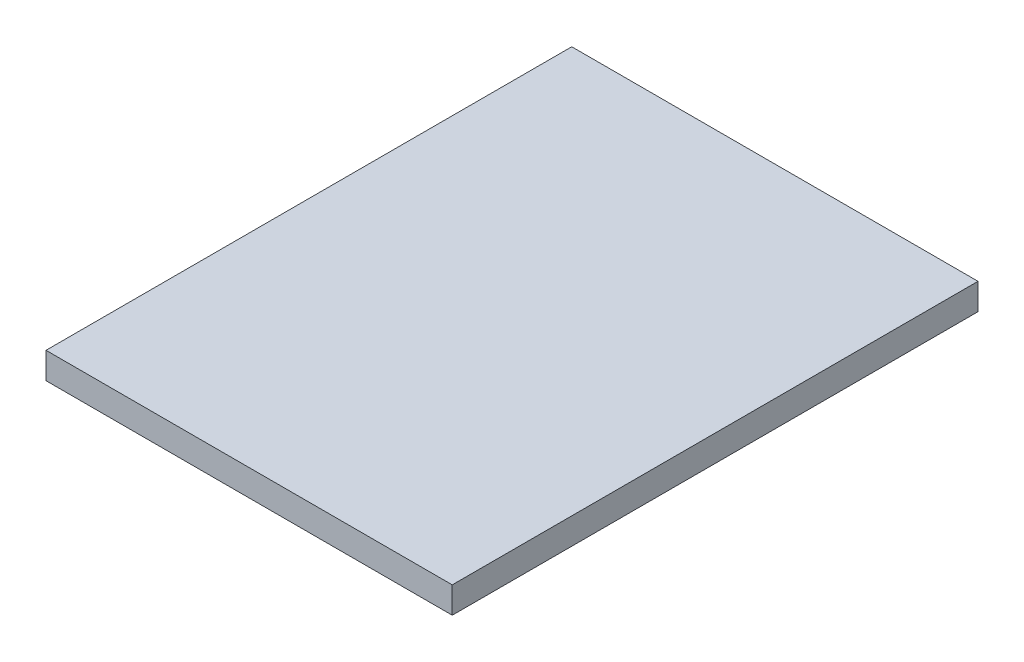
ISO-10303-21;
HEADER;
FILE_DESCRIPTION(('STEP AP214'),'2;1');
FILE_NAME('part.step','',(''),(''),'','','');
FILE_SCHEMA(('AUTOMOTIVE_DESIGN { 1 0 10303 214 1 1 1 1 }'));
ENDSEC;
DATA;
#1=APPLICATION_CONTEXT('core data for automotive mechanical design processes');
#2=APPLICATION_PROTOCOL_DEFINITION('international standard','automotive_design',2000,#1);
#3=PRODUCT_CONTEXT('',#1,'mechanical');
#4=PRODUCT('Part','Part','',(#3));
#5=PRODUCT_RELATED_PRODUCT_CATEGORY('part','',(#4));
#6=PRODUCT_DEFINITION_FORMATION('','',#4);
#7=PRODUCT_DEFINITION_CONTEXT('part definition',#1,'design');
#8=PRODUCT_DEFINITION('design','',#6,#7);
#9=PRODUCT_DEFINITION_SHAPE('','',#8);
#10=(LENGTH_UNIT() NAMED_UNIT(*) SI_UNIT(.MILLI.,.METRE.));
#11=(NAMED_UNIT(*) PLANE_ANGLE_UNIT() SI_UNIT($,.RADIAN.));
#12=(NAMED_UNIT(*) SI_UNIT($,.STERADIAN.) SOLID_ANGLE_UNIT());
#13=UNCERTAINTY_MEASURE_WITH_UNIT(LENGTH_MEASURE(1.E-05),#10,'distance_accuracy_value','');
#14=(GEOMETRIC_REPRESENTATION_CONTEXT(3) GLOBAL_UNCERTAINTY_ASSIGNED_CONTEXT((#13)) GLOBAL_UNIT_ASSIGNED_CONTEXT((#10,
#11,#12)) REPRESENTATION_CONTEXT('',''));
#15=CARTESIAN_POINT('',(0.,0.,0.));
#16=DIRECTION('',(0.,0.,1.));
#17=DIRECTION('',(1.,0.,0.));
#18=AXIS2_PLACEMENT_3D('',#15,#16,#17);
#19=CARTESIAN_POINT('',(41.5,201.5,-798.5));
#20=DIRECTION('',(-1.,0.,0.));
#21=DIRECTION('',(0.,0.,1.));
#22=AXIS2_PLACEMENT_3D('',#19,#20,#21);
#23=PLANE('',#22);
#24=DIRECTION('',(0.,-1.,0.));
#25=VECTOR('',#24,1.);
#26=CARTESIAN_POINT('',(41.5,201.5,0.));
#27=LINE('',#26,#25);
#28=CARTESIAN_POINT('',(41.5,241.5,0.));
#29=VERTEX_POINT('',#28);
#30=CARTESIAN_POINT('',(41.5,201.5,0.));
#31=VERTEX_POINT('',#30);
#32=EDGE_CURVE('E103',#29,#31,#27,.T.);
#33=ORIENTED_EDGE('',*,*,#32,.F.);
#34=DIRECTION('',(0.,0.,1.));
#35=VECTOR('',#34,1.);
#36=CARTESIAN_POINT('',(41.5,241.5,-798.5));
#37=LINE('',#36,#35);
#38=CARTESIAN_POINT('',(41.5,241.5,-798.5));
#39=VERTEX_POINT('',#38);
#40=EDGE_CURVE('E11',#39,#29,#37,.T.);
#41=ORIENTED_EDGE('',*,*,#40,.F.);
#42=DIRECTION('',(0.,-1.,0.));
#43=VECTOR('',#42,1.);
#44=CARTESIAN_POINT('',(41.5,201.5,-798.5));
#45=LINE('',#44,#43);
#46=CARTESIAN_POINT('',(41.5,201.5,-798.5));
#47=VERTEX_POINT('',#46);
#48=EDGE_CURVE('E97',#39,#47,#45,.T.);
#49=ORIENTED_EDGE('',*,*,#48,.T.);
#50=DIRECTION('',(0.,0.,1.));
#51=VECTOR('',#50,1.);
#52=CARTESIAN_POINT('',(41.5,201.5,-798.5));
#53=LINE('',#52,#51);
#54=EDGE_CURVE('E42',#47,#31,#53,.T.);
#55=ORIENTED_EDGE('',*,*,#54,.T.);
#56=EDGE_LOOP('',(#33,#41,#49,#55));
#57=FACE_BOUND('',#56,.T.);
#58=ADVANCED_FACE('F39',(#57),#23,.T.);
#59=CARTESIAN_POINT('',(41.5,241.5,-798.5));
#60=DIRECTION('',(0.,1.,0.));
#61=DIRECTION('',(0.,0.,1.));
#62=AXIS2_PLACEMENT_3D('',#59,#60,#61);
#63=PLANE('',#62);
#64=DIRECTION('',(-1.,0.,0.));
#65=VECTOR('',#64,1.);
#66=CARTESIAN_POINT('',(41.5,241.5,0.));
#67=LINE('',#66,#65);
#68=CARTESIAN_POINT('',(658.5,241.5,0.));
#69=VERTEX_POINT('',#68);
#70=EDGE_CURVE('E99',#69,#29,#67,.T.);
#71=ORIENTED_EDGE('',*,*,#70,.F.);
#72=DIRECTION('',(0.,0.,1.));
#73=VECTOR('',#72,1.);
#74=CARTESIAN_POINT('',(658.5,241.5,-798.5));
#75=LINE('',#74,#73);
#76=CARTESIAN_POINT('',(658.5,241.5,-798.5));
#77=VERTEX_POINT('',#76);
#78=EDGE_CURVE('E48',#77,#69,#75,.T.);
#79=ORIENTED_EDGE('',*,*,#78,.F.);
#80=DIRECTION('',(-1.,0.,0.));
#81=VECTOR('',#80,1.);
#82=CARTESIAN_POINT('',(41.5,241.5,-798.5));
#83=LINE('',#82,#81);
#84=EDGE_CURVE('E94',#77,#39,#83,.T.);
#85=ORIENTED_EDGE('',*,*,#84,.T.);
#86=ORIENTED_EDGE('',*,*,#40,.T.);
#87=EDGE_LOOP('',(#71,#79,#85,#86));
#88=FACE_BOUND('',#87,.T.);
#89=ADVANCED_FACE('F113',(#88),#63,.T.);
#90=CARTESIAN_POINT('',(658.5,201.5,-798.5));
#91=DIRECTION('',(1.,0.,0.));
#92=DIRECTION('',(0.,0.,-1.));
#93=AXIS2_PLACEMENT_3D('',#90,#91,#92);
#94=PLANE('',#93);
#95=DIRECTION('',(0.,1.,0.));
#96=VECTOR('',#95,1.);
#97=CARTESIAN_POINT('',(658.5,201.5,0.));
#98=LINE('',#97,#96);
#99=CARTESIAN_POINT('',(658.5,201.5,0.));
#100=VERTEX_POINT('',#99);
#101=EDGE_CURVE('E89',#100,#69,#98,.T.);
#102=ORIENTED_EDGE('',*,*,#101,.F.);
#103=DIRECTION('',(0.,0.,1.));
#104=VECTOR('',#103,1.);
#105=CARTESIAN_POINT('',(658.5,201.5,-798.5));
#106=LINE('',#105,#104);
#107=CARTESIAN_POINT('',(658.5,201.5,-798.5));
#108=VERTEX_POINT('',#107);
#109=EDGE_CURVE('E84',#108,#100,#106,.T.);
#110=ORIENTED_EDGE('',*,*,#109,.F.);
#111=DIRECTION('',(0.,1.,0.));
#112=VECTOR('',#111,1.);
#113=CARTESIAN_POINT('',(658.5,201.5,-798.5));
#114=LINE('',#113,#112);
#115=EDGE_CURVE('E87',#108,#77,#114,.T.);
#116=ORIENTED_EDGE('',*,*,#115,.T.);
#117=ORIENTED_EDGE('',*,*,#78,.T.);
#118=EDGE_LOOP('',(#102,#110,#116,#117));
#119=FACE_BOUND('',#118,.T.);
#120=ADVANCED_FACE('F86',(#119),#94,.T.);
#121=CARTESIAN_POINT('',(41.5,201.5,-798.5));
#122=DIRECTION('',(0.,-1.,0.));
#123=DIRECTION('',(0.,0.,-1.));
#124=AXIS2_PLACEMENT_3D('',#121,#122,#123);
#125=PLANE('',#124);
#126=DIRECTION('',(1.,0.,0.));
#127=VECTOR('',#126,1.);
#128=CARTESIAN_POINT('',(41.5,201.5,0.));
#129=LINE('',#128,#127);
#130=EDGE_CURVE('E106',#31,#100,#129,.T.);
#131=ORIENTED_EDGE('',*,*,#130,.F.);
#132=ORIENTED_EDGE('',*,*,#54,.F.);
#133=DIRECTION('',(1.,0.,0.));
#134=VECTOR('',#133,1.);
#135=CARTESIAN_POINT('',(41.5,201.5,-798.5));
#136=LINE('',#135,#134);
#137=EDGE_CURVE('E93',#47,#108,#136,.T.);
#138=ORIENTED_EDGE('',*,*,#137,.T.);
#139=ORIENTED_EDGE('',*,*,#109,.T.);
#140=EDGE_LOOP('',(#131,#132,#138,#139));
#141=FACE_BOUND('',#140,.T.);
#142=ADVANCED_FACE('F96',(#141),#125,.T.);
#143=CARTESIAN_POINT('',(0.,0.,-798.5));
#144=DIRECTION('',(0.,0.,-1.));
#145=DIRECTION('',(-1.,0.,0.));
#146=AXIS2_PLACEMENT_3D('',#143,#144,#145);
#147=PLANE('',#146);
#148=ORIENTED_EDGE('',*,*,#48,.F.);
#149=ORIENTED_EDGE('',*,*,#84,.F.);
#150=ORIENTED_EDGE('',*,*,#115,.F.);
#151=ORIENTED_EDGE('',*,*,#137,.F.);
#152=EDGE_LOOP('',(#148,#149,#150,#151));
#153=FACE_BOUND('',#152,.T.);
#154=ADVANCED_FACE('F92',(#153),#147,.T.);
#155=CARTESIAN_POINT('',(0.,0.,0.));
#156=DIRECTION('',(0.,0.,-1.));
#157=DIRECTION('',(-1.,0.,0.));
#158=AXIS2_PLACEMENT_3D('',#155,#156,#157);
#159=PLANE('',#158);
#160=ORIENTED_EDGE('',*,*,#32,.T.);
#161=ORIENTED_EDGE('',*,*,#130,.T.);
#162=ORIENTED_EDGE('',*,*,#101,.T.);
#163=ORIENTED_EDGE('',*,*,#70,.T.);
#164=EDGE_LOOP('',(#160,#161,#162,#163));
#165=FACE_BOUND('',#164,.T.);
#166=ADVANCED_FACE('F112',(#165),#159,.F.);
#167=CLOSED_SHELL('',(#58,#89,#120,#142,#154,#166));
#168=MANIFOLD_SOLID_BREP('B2',#167);
#169=ADVANCED_BREP_SHAPE_REPRESENTATION('',(#18,#168),#14);
#170=SHAPE_DEFINITION_REPRESENTATION(#9,#169);
ENDSEC;
END-ISO-10303-21;
